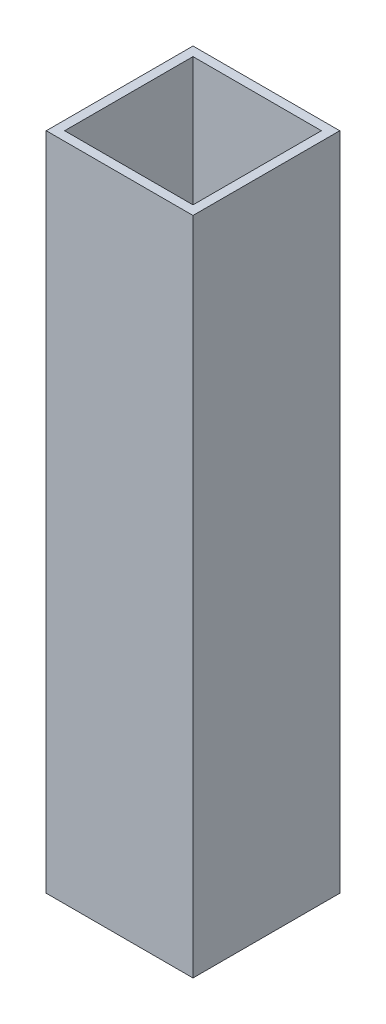
ISO-10303-21;
HEADER;
FILE_DESCRIPTION(('STEP AP214'),'2;1');
FILE_NAME('part.step','',(''),(''),'','','');
FILE_SCHEMA(('AUTOMOTIVE_DESIGN { 1 0 10303 214 1 1 1 1 }'));
ENDSEC;
DATA;
#1=APPLICATION_CONTEXT('core data for automotive mechanical design processes');
#2=APPLICATION_PROTOCOL_DEFINITION('international standard','automotive_design',2000,#1);
#3=PRODUCT_CONTEXT('',#1,'mechanical');
#4=PRODUCT('Part','Part','',(#3));
#5=PRODUCT_RELATED_PRODUCT_CATEGORY('part','',(#4));
#6=PRODUCT_DEFINITION_FORMATION('','',#4);
#7=PRODUCT_DEFINITION_CONTEXT('part definition',#1,'design');
#8=PRODUCT_DEFINITION('design','',#6,#7);
#9=PRODUCT_DEFINITION_SHAPE('','',#8);
#10=(LENGTH_UNIT() NAMED_UNIT(*) SI_UNIT(.MILLI.,.METRE.));
#11=(NAMED_UNIT(*) PLANE_ANGLE_UNIT() SI_UNIT($,.RADIAN.));
#12=(NAMED_UNIT(*) SI_UNIT($,.STERADIAN.) SOLID_ANGLE_UNIT());
#13=UNCERTAINTY_MEASURE_WITH_UNIT(LENGTH_MEASURE(1.E-05),#10,'distance_accuracy_value','');
#14=(GEOMETRIC_REPRESENTATION_CONTEXT(3) GLOBAL_UNCERTAINTY_ASSIGNED_CONTEXT((#13)) GLOBAL_UNIT_ASSIGNED_CONTEXT((#10,
#11,#12)) REPRESENTATION_CONTEXT('',''));
#15=CARTESIAN_POINT('',(0.,0.,0.));
#16=DIRECTION('',(0.,0.,1.));
#17=DIRECTION('',(1.,0.,0.));
#18=AXIS2_PLACEMENT_3D('',#15,#16,#17);
#19=CARTESIAN_POINT('',(0.,114.3,0.));
#20=DIRECTION('',(0.,-1.,0.));
#21=DIRECTION('',(0.,0.,-1.));
#22=AXIS2_PLACEMENT_3D('',#19,#20,#21);
#23=PLANE('',#22);
#24=DIRECTION('',(0.,0.,1.));
#25=VECTOR('',#24,1.);
#26=CARTESIAN_POINT('',(-12.7,114.3,-12.7));
#27=LINE('',#26,#25);
#28=CARTESIAN_POINT('',(-12.7,114.3,-12.7));
#29=VERTEX_POINT('',#28);
#30=CARTESIAN_POINT('',(-12.7,114.3,12.7));
#31=VERTEX_POINT('',#30);
#32=EDGE_CURVE('E133',#29,#31,#27,.T.);
#33=ORIENTED_EDGE('',*,*,#32,.T.);
#34=DIRECTION('',(1.,0.,0.));
#35=VECTOR('',#34,1.);
#36=CARTESIAN_POINT('',(12.7,114.3,12.7));
#37=LINE('',#36,#35);
#38=CARTESIAN_POINT('',(12.7,114.3,12.7));
#39=VERTEX_POINT('',#38);
#40=EDGE_CURVE('E136',#31,#39,#37,.T.);
#41=ORIENTED_EDGE('',*,*,#40,.T.);
#42=DIRECTION('',(0.,0.,-1.));
#43=VECTOR('',#42,1.);
#44=CARTESIAN_POINT('',(12.7,114.3,-12.7));
#45=LINE('',#44,#43);
#46=CARTESIAN_POINT('',(12.7,114.3,-12.7));
#47=VERTEX_POINT('',#46);
#48=EDGE_CURVE('E139',#39,#47,#45,.T.);
#49=ORIENTED_EDGE('',*,*,#48,.T.);
#50=DIRECTION('',(-1.,0.,0.));
#51=VECTOR('',#50,1.);
#52=CARTESIAN_POINT('',(12.7,114.3,-12.7));
#53=LINE('',#52,#51);
#54=EDGE_CURVE('E141',#47,#29,#53,.T.);
#55=ORIENTED_EDGE('',*,*,#54,.T.);
#56=EDGE_LOOP('',(#33,#41,#49,#55));
#57=FACE_BOUND('',#56,.T.);
#58=DIRECTION('',(0.,0.,1.));
#59=VECTOR('',#58,1.);
#60=CARTESIAN_POINT('',(-11.1125,114.3,-11.1125));
#61=LINE('',#60,#59);
#62=CARTESIAN_POINT('',(-11.1125,114.3,-11.1125));
#63=VERTEX_POINT('',#62);
#64=CARTESIAN_POINT('',(-11.1125,114.3,11.1125));
#65=VERTEX_POINT('',#64);
#66=EDGE_CURVE('E97',#63,#65,#61,.T.);
#67=ORIENTED_EDGE('',*,*,#66,.F.);
#68=DIRECTION('',(-1.,0.,0.));
#69=VECTOR('',#68,1.);
#70=CARTESIAN_POINT('',(11.1125,114.3,-11.1125));
#71=LINE('',#70,#69);
#72=CARTESIAN_POINT('',(11.1125,114.3,-11.1125));
#73=VERTEX_POINT('',#72);
#74=EDGE_CURVE('E119',#73,#63,#71,.T.);
#75=ORIENTED_EDGE('',*,*,#74,.F.);
#76=DIRECTION('',(0.,0.,-1.));
#77=VECTOR('',#76,1.);
#78=CARTESIAN_POINT('',(11.1125,114.3,-11.1125));
#79=LINE('',#78,#77);
#80=CARTESIAN_POINT('',(11.1125,114.3,11.1125));
#81=VERTEX_POINT('',#80);
#82=EDGE_CURVE('E117',#81,#73,#79,.T.);
#83=ORIENTED_EDGE('',*,*,#82,.F.);
#84=DIRECTION('',(1.,0.,0.));
#85=VECTOR('',#84,1.);
#86=CARTESIAN_POINT('',(11.1125,114.3,11.1125));
#87=LINE('',#86,#85);
#88=EDGE_CURVE('E105',#65,#81,#87,.T.);
#89=ORIENTED_EDGE('',*,*,#88,.F.);
#90=EDGE_LOOP('',(#67,#75,#83,#89));
#91=FACE_BOUND('',#90,.T.);
#92=ADVANCED_FACE('F32',(#57,#91),#23,.F.);
#93=CARTESIAN_POINT('',(0.,0.,0.));
#94=DIRECTION('',(0.,-1.,0.));
#95=DIRECTION('',(0.,0.,-1.));
#96=AXIS2_PLACEMENT_3D('',#93,#94,#95);
#97=PLANE('',#96);
#98=DIRECTION('',(0.,0.,1.));
#99=VECTOR('',#98,1.);
#100=CARTESIAN_POINT('',(-12.7,0.,-12.7));
#101=LINE('',#100,#99);
#102=CARTESIAN_POINT('',(-12.7,0.,-12.7));
#103=VERTEX_POINT('',#102);
#104=CARTESIAN_POINT('',(-12.7,0.,12.7));
#105=VERTEX_POINT('',#104);
#106=EDGE_CURVE('E113',#103,#105,#101,.T.);
#107=ORIENTED_EDGE('',*,*,#106,.F.);
#108=DIRECTION('',(-1.,0.,0.));
#109=VECTOR('',#108,1.);
#110=CARTESIAN_POINT('',(12.7,0.,-12.7));
#111=LINE('',#110,#109);
#112=CARTESIAN_POINT('',(12.7,0.,-12.7));
#113=VERTEX_POINT('',#112);
#114=EDGE_CURVE('E137',#113,#103,#111,.T.);
#115=ORIENTED_EDGE('',*,*,#114,.F.);
#116=DIRECTION('',(0.,0.,-1.));
#117=VECTOR('',#116,1.);
#118=CARTESIAN_POINT('',(12.7,0.,-12.7));
#119=LINE('',#118,#117);
#120=CARTESIAN_POINT('',(12.7,0.,12.7));
#121=VERTEX_POINT('',#120);
#122=EDGE_CURVE('E148',#121,#113,#119,.T.);
#123=ORIENTED_EDGE('',*,*,#122,.F.);
#124=DIRECTION('',(1.,0.,0.));
#125=VECTOR('',#124,1.);
#126=CARTESIAN_POINT('',(12.7,0.,12.7));
#127=LINE('',#126,#125);
#128=EDGE_CURVE('E146',#105,#121,#127,.T.);
#129=ORIENTED_EDGE('',*,*,#128,.F.);
#130=EDGE_LOOP('',(#107,#115,#123,#129));
#131=FACE_BOUND('',#130,.T.);
#132=DIRECTION('',(-1.,0.,0.));
#133=VECTOR('',#132,1.);
#134=CARTESIAN_POINT('',(11.1125,0.,-11.1125));
#135=LINE('',#134,#133);
#136=CARTESIAN_POINT('',(11.1125,0.,-11.1125));
#137=VERTEX_POINT('',#136);
#138=CARTESIAN_POINT('',(-11.1125,0.,-11.1125));
#139=VERTEX_POINT('',#138);
#140=EDGE_CURVE('E106',#137,#139,#135,.T.);
#141=ORIENTED_EDGE('',*,*,#140,.T.);
#142=DIRECTION('',(0.,0.,1.));
#143=VECTOR('',#142,1.);
#144=CARTESIAN_POINT('',(-11.1125,0.,-11.1125));
#145=LINE('',#144,#143);
#146=CARTESIAN_POINT('',(-11.1125,0.,11.1125));
#147=VERTEX_POINT('',#146);
#148=EDGE_CURVE('E55',#139,#147,#145,.T.);
#149=ORIENTED_EDGE('',*,*,#148,.T.);
#150=DIRECTION('',(1.,0.,0.));
#151=VECTOR('',#150,1.);
#152=CARTESIAN_POINT('',(11.1125,0.,11.1125));
#153=LINE('',#152,#151);
#154=CARTESIAN_POINT('',(11.1125,0.,11.1125));
#155=VERTEX_POINT('',#154);
#156=EDGE_CURVE('E112',#147,#155,#153,.T.);
#157=ORIENTED_EDGE('',*,*,#156,.T.);
#158=DIRECTION('',(0.,0.,-1.));
#159=VECTOR('',#158,1.);
#160=CARTESIAN_POINT('',(11.1125,0.,-11.1125));
#161=LINE('',#160,#159);
#162=EDGE_CURVE('E125',#155,#137,#161,.T.);
#163=ORIENTED_EDGE('',*,*,#162,.T.);
#164=EDGE_LOOP('',(#141,#149,#157,#163));
#165=FACE_BOUND('',#164,.T.);
#166=ADVANCED_FACE('F166',(#131,#165),#97,.T.);
#167=CARTESIAN_POINT('',(-12.7,114.3,-12.7));
#168=DIRECTION('',(1.,0.,0.));
#169=DIRECTION('',(0.,0.,-1.));
#170=AXIS2_PLACEMENT_3D('',#167,#168,#169);
#171=PLANE('',#170);
#172=ORIENTED_EDGE('',*,*,#106,.T.);
#173=DIRECTION('',(0.,-1.,0.));
#174=VECTOR('',#173,1.);
#175=CARTESIAN_POINT('',(-12.7,114.3,12.7));
#176=LINE('',#175,#174);
#177=EDGE_CURVE('E11',#31,#105,#176,.T.);
#178=ORIENTED_EDGE('',*,*,#177,.F.);
#179=ORIENTED_EDGE('',*,*,#32,.F.);
#180=DIRECTION('',(0.,-1.,0.));
#181=VECTOR('',#180,1.);
#182=CARTESIAN_POINT('',(-12.7,114.3,-12.7));
#183=LINE('',#182,#181);
#184=EDGE_CURVE('E143',#29,#103,#183,.T.);
#185=ORIENTED_EDGE('',*,*,#184,.T.);
#186=EDGE_LOOP('',(#172,#178,#179,#185));
#187=FACE_BOUND('',#186,.T.);
#188=ADVANCED_FACE('F34',(#187),#171,.F.);
#189=CARTESIAN_POINT('',(12.7,114.3,12.7));
#190=DIRECTION('',(0.,0.,-1.));
#191=DIRECTION('',(-1.,0.,0.));
#192=AXIS2_PLACEMENT_3D('',#189,#190,#191);
#193=PLANE('',#192);
#194=ORIENTED_EDGE('',*,*,#128,.T.);
#195=DIRECTION('',(0.,-1.,0.));
#196=VECTOR('',#195,1.);
#197=CARTESIAN_POINT('',(12.7,114.3,12.7));
#198=LINE('',#197,#196);
#199=EDGE_CURVE('E40',#39,#121,#198,.T.);
#200=ORIENTED_EDGE('',*,*,#199,.F.);
#201=ORIENTED_EDGE('',*,*,#40,.F.);
#202=ORIENTED_EDGE('',*,*,#177,.T.);
#203=EDGE_LOOP('',(#194,#200,#201,#202));
#204=FACE_BOUND('',#203,.T.);
#205=ADVANCED_FACE('F176',(#204),#193,.F.);
#206=CARTESIAN_POINT('',(12.7,114.3,-12.7));
#207=DIRECTION('',(-1.,0.,0.));
#208=DIRECTION('',(0.,0.,1.));
#209=AXIS2_PLACEMENT_3D('',#206,#207,#208);
#210=PLANE('',#209);
#211=ORIENTED_EDGE('',*,*,#122,.T.);
#212=DIRECTION('',(0.,-1.,0.));
#213=VECTOR('',#212,1.);
#214=CARTESIAN_POINT('',(12.7,114.3,-12.7));
#215=LINE('',#214,#213);
#216=EDGE_CURVE('E153',#47,#113,#215,.T.);
#217=ORIENTED_EDGE('',*,*,#216,.F.);
#218=ORIENTED_EDGE('',*,*,#48,.F.);
#219=ORIENTED_EDGE('',*,*,#199,.T.);
#220=EDGE_LOOP('',(#211,#217,#218,#219));
#221=FACE_BOUND('',#220,.T.);
#222=ADVANCED_FACE('F160',(#221),#210,.F.);
#223=CARTESIAN_POINT('',(12.7,114.3,-12.7));
#224=DIRECTION('',(0.,0.,1.));
#225=DIRECTION('',(1.,0.,0.));
#226=AXIS2_PLACEMENT_3D('',#223,#224,#225);
#227=PLANE('',#226);
#228=ORIENTED_EDGE('',*,*,#114,.T.);
#229=ORIENTED_EDGE('',*,*,#184,.F.);
#230=ORIENTED_EDGE('',*,*,#54,.F.);
#231=ORIENTED_EDGE('',*,*,#216,.T.);
#232=EDGE_LOOP('',(#228,#229,#230,#231));
#233=FACE_BOUND('',#232,.T.);
#234=ADVANCED_FACE('F170',(#233),#227,.F.);
#235=CARTESIAN_POINT('',(-11.1125,114.3,-11.1125));
#236=DIRECTION('',(1.,0.,0.));
#237=DIRECTION('',(0.,0.,-1.));
#238=AXIS2_PLACEMENT_3D('',#235,#236,#237);
#239=PLANE('',#238);
#240=ORIENTED_EDGE('',*,*,#148,.F.);
#241=DIRECTION('',(0.,-1.,0.));
#242=VECTOR('',#241,1.);
#243=CARTESIAN_POINT('',(-11.1125,114.3,-11.1125));
#244=LINE('',#243,#242);
#245=EDGE_CURVE('E101',#63,#139,#244,.T.);
#246=ORIENTED_EDGE('',*,*,#245,.F.);
#247=ORIENTED_EDGE('',*,*,#66,.T.);
#248=DIRECTION('',(0.,-1.,0.));
#249=VECTOR('',#248,1.);
#250=CARTESIAN_POINT('',(-11.1125,114.3,11.1125));
#251=LINE('',#250,#249);
#252=EDGE_CURVE('E100',#65,#147,#251,.T.);
#253=ORIENTED_EDGE('',*,*,#252,.T.);
#254=EDGE_LOOP('',(#240,#246,#247,#253));
#255=FACE_BOUND('',#254,.T.);
#256=ADVANCED_FACE('F99',(#255),#239,.T.);
#257=CARTESIAN_POINT('',(11.1125,114.3,11.1125));
#258=DIRECTION('',(0.,0.,-1.));
#259=DIRECTION('',(-1.,0.,0.));
#260=AXIS2_PLACEMENT_3D('',#257,#258,#259);
#261=PLANE('',#260);
#262=ORIENTED_EDGE('',*,*,#156,.F.);
#263=ORIENTED_EDGE('',*,*,#252,.F.);
#264=ORIENTED_EDGE('',*,*,#88,.T.);
#265=DIRECTION('',(0.,-1.,0.));
#266=VECTOR('',#265,1.);
#267=CARTESIAN_POINT('',(11.1125,114.3,11.1125));
#268=LINE('',#267,#266);
#269=EDGE_CURVE('E114',#81,#155,#268,.T.);
#270=ORIENTED_EDGE('',*,*,#269,.T.);
#271=EDGE_LOOP('',(#262,#263,#264,#270));
#272=FACE_BOUND('',#271,.T.);
#273=ADVANCED_FACE('F109',(#272),#261,.T.);
#274=CARTESIAN_POINT('',(11.1125,114.3,-11.1125));
#275=DIRECTION('',(-1.,0.,0.));
#276=DIRECTION('',(0.,0.,1.));
#277=AXIS2_PLACEMENT_3D('',#274,#275,#276);
#278=PLANE('',#277);
#279=ORIENTED_EDGE('',*,*,#162,.F.);
#280=ORIENTED_EDGE('',*,*,#269,.F.);
#281=ORIENTED_EDGE('',*,*,#82,.T.);
#282=DIRECTION('',(0.,-1.,0.));
#283=VECTOR('',#282,1.);
#284=CARTESIAN_POINT('',(11.1125,114.3,-11.1125));
#285=LINE('',#284,#283);
#286=EDGE_CURVE('E47',#73,#137,#285,.T.);
#287=ORIENTED_EDGE('',*,*,#286,.T.);
#288=EDGE_LOOP('',(#279,#280,#281,#287));
#289=FACE_BOUND('',#288,.T.);
#290=ADVANCED_FACE('F199',(#289),#278,.T.);
#291=CARTESIAN_POINT('',(11.1125,114.3,-11.1125));
#292=DIRECTION('',(0.,0.,1.));
#293=DIRECTION('',(1.,0.,0.));
#294=AXIS2_PLACEMENT_3D('',#291,#292,#293);
#295=PLANE('',#294);
#296=ORIENTED_EDGE('',*,*,#140,.F.);
#297=ORIENTED_EDGE('',*,*,#286,.F.);
#298=ORIENTED_EDGE('',*,*,#74,.T.);
#299=ORIENTED_EDGE('',*,*,#245,.T.);
#300=EDGE_LOOP('',(#296,#297,#298,#299));
#301=FACE_BOUND('',#300,.T.);
#302=ADVANCED_FACE('F203',(#301),#295,.T.);
#303=CLOSED_SHELL('',(#92,#166,#188,#205,#222,#234,#256,#273,#290,#302));
#304=MANIFOLD_SOLID_BREP('B2',#303);
#305=ADVANCED_BREP_SHAPE_REPRESENTATION('',(#18,#304),#14);
#306=SHAPE_DEFINITION_REPRESENTATION(#9,#305);
ENDSEC;
END-ISO-10303-21;
